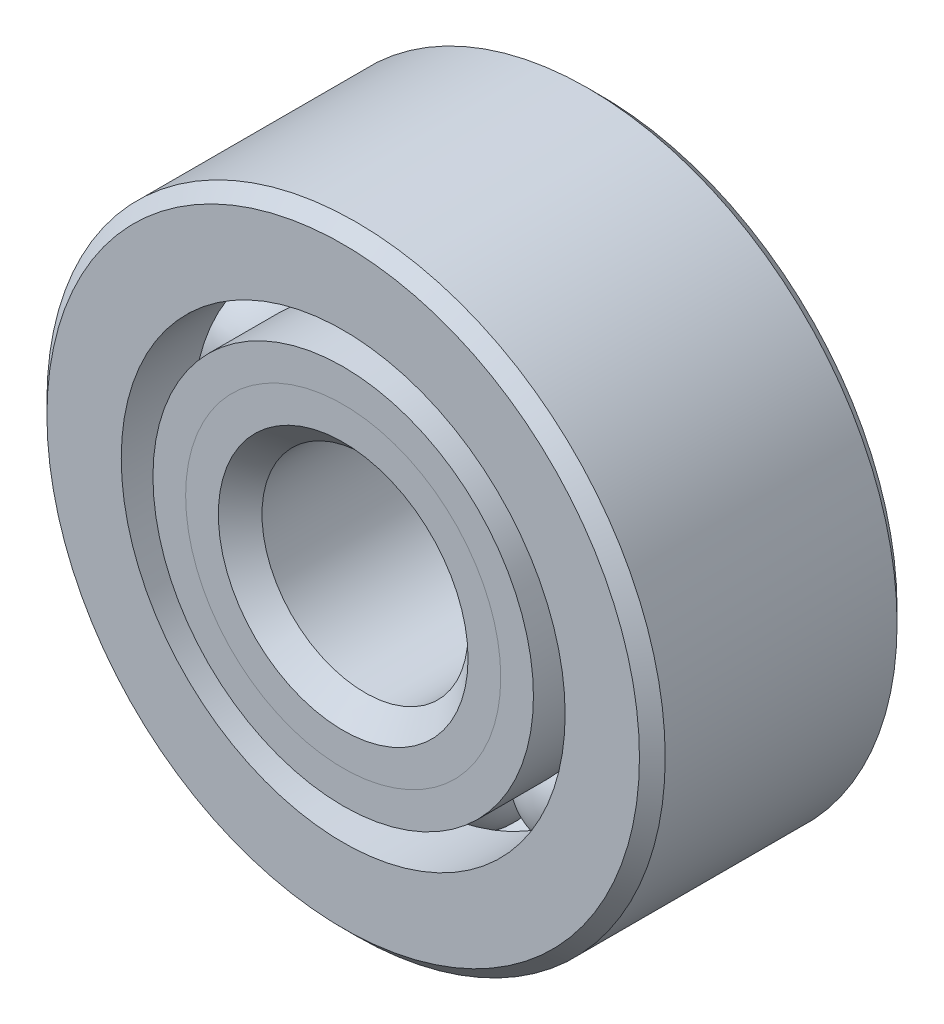
ISO-10303-21;
HEADER;
FILE_DESCRIPTION(('STEP AP214'),'2;1');
FILE_NAME('part.step','',(''),(''),'','','');
FILE_SCHEMA(('AUTOMOTIVE_DESIGN { 1 0 10303 214 1 1 1 1 }'));
ENDSEC;
DATA;
#1=APPLICATION_CONTEXT('core data for automotive mechanical design processes');
#2=APPLICATION_PROTOCOL_DEFINITION('international standard','automotive_design',2000,#1);
#3=PRODUCT_CONTEXT('',#1,'mechanical');
#4=PRODUCT('Part','Part','',(#3));
#5=PRODUCT_RELATED_PRODUCT_CATEGORY('part','',(#4));
#6=PRODUCT_DEFINITION_FORMATION('','',#4);
#7=PRODUCT_DEFINITION_CONTEXT('part definition',#1,'design');
#8=PRODUCT_DEFINITION('design','',#6,#7);
#9=PRODUCT_DEFINITION_SHAPE('','',#8);
#10=(LENGTH_UNIT() NAMED_UNIT(*) SI_UNIT(.MILLI.,.METRE.));
#11=(NAMED_UNIT(*) PLANE_ANGLE_UNIT() SI_UNIT($,.RADIAN.));
#12=(NAMED_UNIT(*) SI_UNIT($,.STERADIAN.) SOLID_ANGLE_UNIT());
#13=UNCERTAINTY_MEASURE_WITH_UNIT(LENGTH_MEASURE(1.E-05),#10,'distance_accuracy_value','');
#14=(GEOMETRIC_REPRESENTATION_CONTEXT(3) GLOBAL_UNCERTAINTY_ASSIGNED_CONTEXT((#13)) GLOBAL_UNIT_ASSIGNED_CONTEXT((#10,
#11,#12)) REPRESENTATION_CONTEXT('',''));
#15=CARTESIAN_POINT('',(0.,0.,0.));
#16=DIRECTION('',(0.,0.,1.));
#17=DIRECTION('',(1.,0.,0.));
#18=AXIS2_PLACEMENT_3D('',#15,#16,#17);
#19=CARTESIAN_POINT('',(-1.86621817602857,2.56862895714048,0.));
#20=DIRECTION('',(0.,0.,1.));
#21=DIRECTION('',(-0.587785252292462,0.809016994374955,0.));
#22=AXIS2_PLACEMENT_3D('',#19,#20,#21);
#23=SPHERICAL_SURFACE('',#22,0.915136422466876);
#24=CARTESIAN_POINT('',(-1.86621817602857,2.56862895714048,0.915136422466875));
#25=VERTEX_POINT('',#24);
#26=VERTEX_LOOP('',#25);
#27=FACE_BOUND('',#26,.T.);
#28=ADVANCED_FACE('F39',(#27),#23,.T.);
#29=CLOSED_SHELL('',(#28));
#30=MANIFOLD_SOLID_BREP('B2',#29);
#31=CARTESIAN_POINT('',(-3.0196044392371,0.981128957140492,0.));
#32=DIRECTION('',(0.,0.,1.));
#33=DIRECTION('',(-0.95105651629515,0.309016994374958,0.));
#34=AXIS2_PLACEMENT_3D('',#31,#32,#33);
#35=SPHERICAL_SURFACE('',#34,0.915136422466876);
#36=CARTESIAN_POINT('',(-3.0196044392371,0.981128957140492,0.915136422466875));
#37=VERTEX_POINT('',#36);
#38=VERTEX_LOOP('',#37);
#39=FACE_BOUND('',#38,.T.);
#40=ADVANCED_FACE('F72',(#39),#35,.T.);
#41=CLOSED_SHELL('',(#40));
#42=MANIFOLD_SOLID_BREP('B6',#41);
#43=CARTESIAN_POINT('',(-3.01960443923712,-0.981128957140429,0.));
#44=DIRECTION('',(0.,0.,1.));
#45=DIRECTION('',(-0.951056516295157,-0.309016994374938,0.));
#46=AXIS2_PLACEMENT_3D('',#43,#44,#45);
#47=SPHERICAL_SURFACE('',#46,0.915136422466876);
#48=CARTESIAN_POINT('',(-3.01960443923712,-0.981128957140429,0.915136422466875));
#49=VERTEX_POINT('',#48);
#50=VERTEX_LOOP('',#49);
#51=FACE_BOUND('',#50,.T.);
#52=ADVANCED_FACE('F105',(#51),#47,.T.);
#53=CLOSED_SHELL('',(#52));
#54=MANIFOLD_SOLID_BREP('B35',#53);
#55=CARTESIAN_POINT('',(-1.86621817602862,-2.56862895714044,0.));
#56=DIRECTION('',(0.,0.,1.));
#57=DIRECTION('',(-0.58778525229248,-0.809016994374942,0.));
#58=AXIS2_PLACEMENT_3D('',#55,#56,#57);
#59=SPHERICAL_SURFACE('',#58,0.915136422466876);
#60=CARTESIAN_POINT('',(-1.86621817602862,-2.56862895714044,0.915136422466875));
#61=VERTEX_POINT('',#60);
#62=VERTEX_LOOP('',#61);
#63=FACE_BOUND('',#62,.T.);
#64=ADVANCED_FACE('F138',(#63),#59,.T.);
#65=CLOSED_SHELL('',(#64));
#66=MANIFOLD_SOLID_BREP('B68',#65);
#67=CARTESIAN_POINT('',(0.,-3.175,0.));
#68=DIRECTION('',(0.,0.,1.));
#69=DIRECTION('',(0.,-1.,0.));
#70=AXIS2_PLACEMENT_3D('',#67,#68,#69);
#71=SPHERICAL_SURFACE('',#70,0.915136422466876);
#72=CARTESIAN_POINT('',(0.,-3.175,0.915136422466875));
#73=VERTEX_POINT('',#72);
#74=VERTEX_LOOP('',#73);
#75=FACE_BOUND('',#74,.T.);
#76=ADVANCED_FACE('F171',(#75),#71,.T.);
#77=CLOSED_SHELL('',(#76));
#78=MANIFOLD_SOLID_BREP('B101',#77);
#79=CARTESIAN_POINT('',(1.86621817602859,-2.56862895714047,0.));
#80=DIRECTION('',(0.,0.,1.));
#81=DIRECTION('',(0.587785252292469,-0.809016994374951,0.));
#82=AXIS2_PLACEMENT_3D('',#79,#80,#81);
#83=SPHERICAL_SURFACE('',#82,0.915136422466876);
#84=CARTESIAN_POINT('',(1.86621817602859,-2.56862895714047,0.915136422466875));
#85=VERTEX_POINT('',#84);
#86=VERTEX_LOOP('',#85);
#87=FACE_BOUND('',#86,.T.);
#88=ADVANCED_FACE('F204',(#87),#83,.T.);
#89=CLOSED_SHELL('',(#88));
#90=MANIFOLD_SOLID_BREP('B134',#89);
#91=CARTESIAN_POINT('',(3.01960443923711,-0.981128957140471,0.));
#92=DIRECTION('',(0.,0.,1.));
#93=DIRECTION('',(0.951056516295152,-0.309016994374952,0.));
#94=AXIS2_PLACEMENT_3D('',#91,#92,#93);
#95=SPHERICAL_SURFACE('',#94,0.915136422466876);
#96=CARTESIAN_POINT('',(3.01960443923711,-0.981128957140471,0.915136422466875));
#97=VERTEX_POINT('',#96);
#98=VERTEX_LOOP('',#97);
#99=FACE_BOUND('',#98,.T.);
#100=ADVANCED_FACE('F237',(#99),#95,.T.);
#101=CLOSED_SHELL('',(#100));
#102=MANIFOLD_SOLID_BREP('B167',#101);
#103=CARTESIAN_POINT('',(3.01960443923712,0.98112895714045,0.));
#104=DIRECTION('',(0.,0.,1.));
#105=DIRECTION('',(0.951056516295155,0.309016994374945,0.));
#106=AXIS2_PLACEMENT_3D('',#103,#104,#105);
#107=SPHERICAL_SURFACE('',#106,0.915136422466876);
#108=CARTESIAN_POINT('',(3.01960443923712,0.98112895714045,0.915136422466875));
#109=VERTEX_POINT('',#108);
#110=VERTEX_LOOP('',#109);
#111=FACE_BOUND('',#110,.T.);
#112=ADVANCED_FACE('F270',(#111),#107,.T.);
#113=CLOSED_SHELL('',(#112));
#114=MANIFOLD_SOLID_BREP('B200',#113);
#115=CARTESIAN_POINT('',(1.86621817602861,2.56862895714046,0.));
#116=DIRECTION('',(0.,0.,1.));
#117=DIRECTION('',(0.587785252292474,0.809016994374947,0.));
#118=AXIS2_PLACEMENT_3D('',#115,#116,#117);
#119=SPHERICAL_SURFACE('',#118,0.915136422466876);
#120=CARTESIAN_POINT('',(1.86621817602861,2.56862895714046,0.915136422466875));
#121=VERTEX_POINT('',#120);
#122=VERTEX_LOOP('',#121);
#123=FACE_BOUND('',#122,.T.);
#124=ADVANCED_FACE('F303',(#123),#119,.T.);
#125=CLOSED_SHELL('',(#124));
#126=MANIFOLD_SOLID_BREP('B233',#125);
#127=CARTESIAN_POINT('',(0.,3.175,0.));
#128=DIRECTION('',(0.,0.,1.));
#129=DIRECTION('',(0.,1.,0.));
#130=AXIS2_PLACEMENT_3D('',#127,#128,#129);
#131=SPHERICAL_SURFACE('',#130,0.915136422466876);
#132=CARTESIAN_POINT('',(0.,3.175,0.915136422466875));
#133=VERTEX_POINT('',#132);
#134=VERTEX_LOOP('',#133);
#135=FACE_BOUND('',#134,.T.);
#136=ADVANCED_FACE('F338',(#135),#131,.T.);
#137=CLOSED_SHELL('',(#136));
#138=MANIFOLD_SOLID_BREP('B266',#137);
#139=CARTESIAN_POINT('',(0.,2.4272255097679,1.984375));
#140=DIRECTION('',(0.,0.,-1.));
#141=DIRECTION('',(-1.,0.,0.));
#142=AXIS2_PLACEMENT_3D('',#139,#140,#141);
#143=PLANE('',#142);
#144=CARTESIAN_POINT('',(0.,0.,1.984375));
#145=DIRECTION('',(0.,0.,1.));
#146=DIRECTION('',(1.,0.,0.));
#147=AXIS2_PLACEMENT_3D('',#144,#145,#146);
#148=CIRCLE('',#147,1.92368178876656);
#149=CARTESIAN_POINT('',(1.92368178876656,0.,1.984375));
#150=VERTEX_POINT('',#149);
#151=EDGE_CURVE('E392',#150,#150,#148,.T.);
#152=ORIENTED_EDGE('',*,*,#151,.F.);
#153=EDGE_LOOP('',(#152));
#154=FACE_BOUND('',#153,.T.);
#155=CARTESIAN_POINT('',(0.,0.,1.984375));
#156=DIRECTION('',(0.,0.,1.));
#157=DIRECTION('',(1.,0.,0.));
#158=AXIS2_PLACEMENT_3D('',#155,#156,#157);
#159=CIRCLE('',#158,2.4272255097679);
#160=CARTESIAN_POINT('',(2.4272255097679,0.,1.984375));
#161=VERTEX_POINT('',#160);
#162=EDGE_CURVE('E337',#161,#161,#159,.T.);
#163=ORIENTED_EDGE('',*,*,#162,.T.);
#164=EDGE_LOOP('',(#163));
#165=FACE_BOUND('',#164,.T.);
#166=ADVANCED_FACE('F358',(#154,#165),#143,.F.);
#167=CARTESIAN_POINT('',(0.,0.,1.48083127899867));
#168=DIRECTION('',(0.,0.,1.));
#169=DIRECTION('',(1.,0.,0.));
#170=AXIS2_PLACEMENT_3D('',#167,#168,#169);
#171=CONICAL_SURFACE('',#170,1.92368178876656,0.78539816339745);
#172=ORIENTED_EDGE('',*,*,#162,.F.);
#173=EDGE_LOOP('',(#172));
#174=FACE_BOUND('',#173,.T.);
#175=CARTESIAN_POINT('',(0.,0.,1.48083127899867));
#176=DIRECTION('',(0.,0.,1.));
#177=DIRECTION('',(1.,0.,0.));
#178=AXIS2_PLACEMENT_3D('',#175,#176,#177);
#179=CIRCLE('',#178,1.92368178876656);
#180=CARTESIAN_POINT('',(1.92368178876656,0.,1.48083127899867));
#181=VERTEX_POINT('',#180);
#182=EDGE_CURVE('E364',#181,#181,#179,.T.);
#183=ORIENTED_EDGE('',*,*,#182,.T.);
#184=EDGE_LOOP('',(#183));
#185=FACE_BOUND('',#184,.T.);
#186=ADVANCED_FACE('F399',(#174,#185),#171,.T.);
#187=CARTESIAN_POINT('',(0.,0.,1.984375));
#188=DIRECTION('',(0.,0.,1.));
#189=DIRECTION('',(1.,0.,0.));
#190=AXIS2_PLACEMENT_3D('',#187,#188,#189);
#191=CYLINDRICAL_SURFACE('',#190,1.92368178876656);
#192=ORIENTED_EDGE('',*,*,#182,.F.);
#193=EDGE_LOOP('',(#192));
#194=FACE_BOUND('',#193,.T.);
#195=CARTESIAN_POINT('',(0.,0.,0.));
#196=DIRECTION('',(0.,0.,1.));
#197=DIRECTION('',(1.,0.,0.));
#198=AXIS2_PLACEMENT_3D('',#195,#196,#197);
#199=CIRCLE('',#198,1.92368178876656);
#200=CARTESIAN_POINT('',(1.92368178876656,0.,0.));
#201=VERTEX_POINT('',#200);
#202=EDGE_CURVE('E368',#201,#201,#199,.T.);
#203=ORIENTED_EDGE('',*,*,#202,.T.);
#204=EDGE_LOOP('',(#203));
#205=FACE_BOUND('',#204,.T.);
#206=ADVANCED_FACE('F403',(#194,#205),#191,.T.);
#207=CARTESIAN_POINT('',(0.,1.92368178876656,0.));
#208=DIRECTION('',(0.,0.,-1.));
#209=DIRECTION('',(-1.,0.,0.));
#210=AXIS2_PLACEMENT_3D('',#207,#208,#209);
#211=PLANE('',#210);
#212=ORIENTED_EDGE('',*,*,#202,.F.);
#213=EDGE_LOOP('',(#212));
#214=FACE_BOUND('',#213,.T.);
#215=CARTESIAN_POINT('',(0.,0.,0.));
#216=DIRECTION('',(0.,0.,1.));
#217=DIRECTION('',(1.,0.,0.));
#218=AXIS2_PLACEMENT_3D('',#215,#216,#217);
#219=CIRCLE('',#218,2.25986357753312);
#220=CARTESIAN_POINT('',(2.25986357753312,0.,0.));
#221=VERTEX_POINT('',#220);
#222=EDGE_CURVE('E372',#221,#221,#219,.T.);
#223=ORIENTED_EDGE('',*,*,#222,.T.);
#224=EDGE_LOOP('',(#223));
#225=FACE_BOUND('',#224,.T.);
#226=ADVANCED_FACE('F408',(#214,#225),#211,.F.);
#227=CARTESIAN_POINT('',(0.,0.,0.));
#228=DIRECTION('',(0.,0.,1.));
#229=DIRECTION('',(1.,0.,0.));
#230=AXIS2_PLACEMENT_3D('',#227,#228,#229);
#231=TOROIDAL_SURFACE('',#230,3.175,0.915136422466876);
#232=ORIENTED_EDGE('',*,*,#222,.F.);
#233=EDGE_LOOP('',(#232));
#234=FACE_BOUND('',#233,.T.);
#235=CARTESIAN_POINT('',(0.,0.,-0.881944444444445));
#236=DIRECTION('',(0.,0.,1.));
#237=DIRECTION('',(1.,0.,0.));
#238=AXIS2_PLACEMENT_3D('',#235,#236,#237);
#239=CIRCLE('',#238,2.93076923076923);
#240=CARTESIAN_POINT('',(2.93076923076923,0.,-0.881944444444445));
#241=VERTEX_POINT('',#240);
#242=EDGE_CURVE('E377',#241,#241,#239,.T.);
#243=ORIENTED_EDGE('',*,*,#242,.T.);
#244=EDGE_LOOP('',(#243));
#245=FACE_BOUND('',#244,.T.);
#246=ADVANCED_FACE('F414',(#234,#245),#231,.F.);
#247=CARTESIAN_POINT('',(0.,0.,1.984375));
#248=DIRECTION('',(0.,0.,1.));
#249=DIRECTION('',(1.,0.,0.));
#250=AXIS2_PLACEMENT_3D('',#247,#248,#249);
#251=CYLINDRICAL_SURFACE('',#250,2.93076923076923);
#252=ORIENTED_EDGE('',*,*,#242,.F.);
#253=EDGE_LOOP('',(#252));
#254=FACE_BOUND('',#253,.T.);
#255=CARTESIAN_POINT('',(0.,0.,-1.984375));
#256=DIRECTION('',(0.,0.,1.));
#257=DIRECTION('',(1.,0.,0.));
#258=AXIS2_PLACEMENT_3D('',#255,#256,#257);
#259=CIRCLE('',#258,2.93076923076923);
#260=CARTESIAN_POINT('',(2.93076923076923,0.,-1.984375));
#261=VERTEX_POINT('',#260);
#262=EDGE_CURVE('E380',#261,#261,#259,.T.);
#263=ORIENTED_EDGE('',*,*,#262,.T.);
#264=EDGE_LOOP('',(#263));
#265=FACE_BOUND('',#264,.T.);
#266=ADVANCED_FACE('F418',(#254,#265),#251,.T.);
#267=CARTESIAN_POINT('',(0.,1.7859375,-1.984375));
#268=DIRECTION('',(0.,0.,1.));
#269=DIRECTION('',(1.,0.,0.));
#270=AXIS2_PLACEMENT_3D('',#267,#268,#269);
#271=PLANE('',#270);
#272=ORIENTED_EDGE('',*,*,#262,.F.);
#273=EDGE_LOOP('',(#272));
#274=FACE_BOUND('',#273,.T.);
#275=CARTESIAN_POINT('',(0.,0.,-1.984375));
#276=DIRECTION('',(0.,0.,1.));
#277=DIRECTION('',(1.,0.,0.));
#278=AXIS2_PLACEMENT_3D('',#275,#276,#277);
#279=CIRCLE('',#278,1.7859375);
#280=CARTESIAN_POINT('',(1.7859375,0.,-1.984375));
#281=VERTEX_POINT('',#280);
#282=EDGE_CURVE('E383',#281,#281,#279,.T.);
#283=ORIENTED_EDGE('',*,*,#282,.T.);
#284=EDGE_LOOP('',(#283));
#285=FACE_BOUND('',#284,.T.);
#286=ADVANCED_FACE('F422',(#274,#285),#271,.F.);
#287=CARTESIAN_POINT('',(0.,0.,-1.7859375));
#288=DIRECTION('',(0.,0.,-1.));
#289=DIRECTION('',(-1.,0.,0.));
#290=AXIS2_PLACEMENT_3D('',#287,#288,#289);
#291=CONICAL_SURFACE('',#290,1.5875,0.785398163397446);
#292=ORIENTED_EDGE('',*,*,#282,.F.);
#293=EDGE_LOOP('',(#292));
#294=FACE_BOUND('',#293,.T.);
#295=CARTESIAN_POINT('',(0.,0.,-1.7859375));
#296=DIRECTION('',(0.,0.,1.));
#297=DIRECTION('',(1.,0.,0.));
#298=AXIS2_PLACEMENT_3D('',#295,#296,#297);
#299=CIRCLE('',#298,1.5875);
#300=CARTESIAN_POINT('',(1.5875,0.,-1.7859375));
#301=VERTEX_POINT('',#300);
#302=EDGE_CURVE('E386',#301,#301,#299,.T.);
#303=ORIENTED_EDGE('',*,*,#302,.T.);
#304=EDGE_LOOP('',(#303));
#305=FACE_BOUND('',#304,.T.);
#306=ADVANCED_FACE('F426',(#294,#305),#291,.F.);
#307=CARTESIAN_POINT('',(0.,0.,1.984375));
#308=DIRECTION('',(0.,0.,1.));
#309=DIRECTION('',(1.,0.,0.));
#310=AXIS2_PLACEMENT_3D('',#307,#308,#309);
#311=CYLINDRICAL_SURFACE('',#310,1.5875);
#312=ORIENTED_EDGE('',*,*,#302,.F.);
#313=EDGE_LOOP('',(#312));
#314=FACE_BOUND('',#313,.T.);
#315=CARTESIAN_POINT('',(0.,0.,1.64819321123344));
#316=DIRECTION('',(0.,0.,1.));
#317=DIRECTION('',(1.,0.,0.));
#318=AXIS2_PLACEMENT_3D('',#315,#316,#317);
#319=CIRCLE('',#318,1.5875);
#320=CARTESIAN_POINT('',(1.5875,0.,1.64819321123344));
#321=VERTEX_POINT('',#320);
#322=EDGE_CURVE('E389',#321,#321,#319,.T.);
#323=ORIENTED_EDGE('',*,*,#322,.T.);
#324=EDGE_LOOP('',(#323));
#325=FACE_BOUND('',#324,.T.);
#326=ADVANCED_FACE('F430',(#314,#325),#311,.F.);
#327=CARTESIAN_POINT('',(0.,0.,1.984375));
#328=DIRECTION('',(0.,0.,1.));
#329=DIRECTION('',(1.,0.,0.));
#330=AXIS2_PLACEMENT_3D('',#327,#328,#329);
#331=CONICAL_SURFACE('',#330,1.92368178876656,0.78539816339745);
#332=ORIENTED_EDGE('',*,*,#322,.F.);
#333=EDGE_LOOP('',(#332));
#334=FACE_BOUND('',#333,.T.);
#335=ORIENTED_EDGE('',*,*,#151,.T.);
#336=EDGE_LOOP('',(#335));
#337=FACE_BOUND('',#336,.T.);
#338=ADVANCED_FACE('F396',(#334,#337),#331,.F.);
#339=CLOSED_SHELL('',(#166,#186,#206,#226,#246,#266,#286,#306,#326,#338));
#340=MANIFOLD_SOLID_BREP('B299',#339);
#341=CARTESIAN_POINT('',(0.,2.93076923076923,1.984375));
#342=DIRECTION('',(0.,0.,-1.));
#343=DIRECTION('',(-1.,0.,0.));
#344=AXIS2_PLACEMENT_3D('',#341,#342,#343);
#345=PLANE('',#344);
#346=CARTESIAN_POINT('',(0.,0.,1.984375));
#347=DIRECTION('',(0.,0.,1.));
#348=DIRECTION('',(1.,0.,0.));
#349=AXIS2_PLACEMENT_3D('',#346,#347,#348);
#350=CIRCLE('',#349,2.4272255097679);
#351=CARTESIAN_POINT('',(2.4272255097679,0.,1.984375));
#352=VERTEX_POINT('',#351);
#353=EDGE_CURVE('E357',#352,#352,#350,.T.);
#354=ORIENTED_EDGE('',*,*,#353,.F.);
#355=EDGE_LOOP('',(#354));
#356=FACE_BOUND('',#355,.T.);
#357=CARTESIAN_POINT('',(0.,0.,1.984375));
#358=DIRECTION('',(0.,0.,1.));
#359=DIRECTION('',(1.,0.,0.));
#360=AXIS2_PLACEMENT_3D('',#357,#358,#359);
#361=CIRCLE('',#360,2.93076923076923);
#362=CARTESIAN_POINT('',(2.93076923076923,0.,1.984375));
#363=VERTEX_POINT('',#362);
#364=EDGE_CURVE('E538',#363,#363,#361,.T.);
#365=ORIENTED_EDGE('',*,*,#364,.T.);
#366=EDGE_LOOP('',(#365));
#367=FACE_BOUND('',#366,.T.);
#368=ADVANCED_FACE('F516',(#356,#367),#345,.F.);
#369=CARTESIAN_POINT('',(0.,0.,1.984375));
#370=DIRECTION('',(0.,0.,1.));
#371=DIRECTION('',(1.,0.,0.));
#372=AXIS2_PLACEMENT_3D('',#369,#370,#371);
#373=CONICAL_SURFACE('',#372,2.4272255097679,0.78539816339745);
#374=CARTESIAN_POINT('',(0.,0.,1.48083127899867));
#375=DIRECTION('',(0.,0.,1.));
#376=DIRECTION('',(1.,0.,0.));
#377=AXIS2_PLACEMENT_3D('',#374,#375,#376);
#378=CIRCLE('',#377,1.92368178876656);
#379=CARTESIAN_POINT('',(1.92368178876656,0.,1.48083127899867));
#380=VERTEX_POINT('',#379);
#381=EDGE_CURVE('E522',#380,#380,#378,.T.);
#382=ORIENTED_EDGE('',*,*,#381,.F.);
#383=EDGE_LOOP('',(#382));
#384=FACE_BOUND('',#383,.T.);
#385=ORIENTED_EDGE('',*,*,#353,.T.);
#386=EDGE_LOOP('',(#385));
#387=FACE_BOUND('',#386,.T.);
#388=ADVANCED_FACE('F563',(#384,#387),#373,.F.);
#389=CARTESIAN_POINT('',(0.,0.,1.984375));
#390=DIRECTION('',(0.,0.,1.));
#391=DIRECTION('',(1.,0.,0.));
#392=AXIS2_PLACEMENT_3D('',#389,#390,#391);
#393=CYLINDRICAL_SURFACE('',#392,1.92368178876656);
#394=CARTESIAN_POINT('',(0.,0.,0.));
#395=DIRECTION('',(0.,0.,1.));
#396=DIRECTION('',(1.,0.,0.));
#397=AXIS2_PLACEMENT_3D('',#394,#395,#396);
#398=CIRCLE('',#397,1.92368178876656);
#399=CARTESIAN_POINT('',(1.92368178876656,0.,0.));
#400=VERTEX_POINT('',#399);
#401=EDGE_CURVE('E526',#400,#400,#398,.T.);
#402=ORIENTED_EDGE('',*,*,#401,.F.);
#403=EDGE_LOOP('',(#402));
#404=FACE_BOUND('',#403,.T.);
#405=ORIENTED_EDGE('',*,*,#381,.T.);
#406=EDGE_LOOP('',(#405));
#407=FACE_BOUND('',#406,.T.);
#408=ADVANCED_FACE('F558',(#404,#407),#393,.F.);
#409=CARTESIAN_POINT('',(0.,1.92368178876656,0.));
#410=DIRECTION('',(0.,0.,1.));
#411=DIRECTION('',(1.,0.,0.));
#412=AXIS2_PLACEMENT_3D('',#409,#410,#411);
#413=PLANE('',#412);
#414=CARTESIAN_POINT('',(0.,0.,0.));
#415=DIRECTION('',(0.,0.,1.));
#416=DIRECTION('',(1.,0.,0.));
#417=AXIS2_PLACEMENT_3D('',#414,#415,#416);
#418=CIRCLE('',#417,2.25986357753312);
#419=CARTESIAN_POINT('',(2.25986357753312,0.,0.));
#420=VERTEX_POINT('',#419);
#421=EDGE_CURVE('E530',#420,#420,#418,.T.);
#422=ORIENTED_EDGE('',*,*,#421,.F.);
#423=EDGE_LOOP('',(#422));
#424=FACE_BOUND('',#423,.T.);
#425=ORIENTED_EDGE('',*,*,#401,.T.);
#426=EDGE_LOOP('',(#425));
#427=FACE_BOUND('',#426,.T.);
#428=ADVANCED_FACE('F552',(#424,#427),#413,.F.);
#429=CARTESIAN_POINT('',(0.,0.,0.));
#430=DIRECTION('',(0.,0.,1.));
#431=DIRECTION('',(1.,0.,0.));
#432=AXIS2_PLACEMENT_3D('',#429,#430,#431);
#433=TOROIDAL_SURFACE('',#432,3.175,0.915136422466876);
#434=CARTESIAN_POINT('',(0.,0.,0.881944444444444));
#435=DIRECTION('',(0.,0.,1.));
#436=DIRECTION('',(1.,0.,0.));
#437=AXIS2_PLACEMENT_3D('',#434,#435,#436);
#438=CIRCLE('',#437,2.93076923076923);
#439=CARTESIAN_POINT('',(2.93076923076923,0.,0.881944444444444));
#440=VERTEX_POINT('',#439);
#441=EDGE_CURVE('E535',#440,#440,#438,.T.);
#442=ORIENTED_EDGE('',*,*,#441,.F.);
#443=EDGE_LOOP('',(#442));
#444=FACE_BOUND('',#443,.T.);
#445=ORIENTED_EDGE('',*,*,#421,.T.);
#446=EDGE_LOOP('',(#445));
#447=FACE_BOUND('',#446,.T.);
#448=ADVANCED_FACE('F546',(#444,#447),#433,.F.);
#449=CARTESIAN_POINT('',(0.,0.,1.984375));
#450=DIRECTION('',(0.,0.,1.));
#451=DIRECTION('',(1.,0.,0.));
#452=AXIS2_PLACEMENT_3D('',#449,#450,#451);
#453=CYLINDRICAL_SURFACE('',#452,2.93076923076923);
#454=ORIENTED_EDGE('',*,*,#364,.F.);
#455=EDGE_LOOP('',(#454));
#456=FACE_BOUND('',#455,.T.);
#457=ORIENTED_EDGE('',*,*,#441,.T.);
#458=EDGE_LOOP('',(#457));
#459=FACE_BOUND('',#458,.T.);
#460=ADVANCED_FACE('F543',(#456,#459),#453,.T.);
#461=CLOSED_SHELL('',(#368,#388,#408,#428,#448,#460));
#462=MANIFOLD_SOLID_BREP('B332',#461);
#463=CARTESIAN_POINT('',(0.,0.,1.7859375));
#464=DIRECTION('',(0.,0.,-1.));
#465=DIRECTION('',(-1.,0.,0.));
#466=AXIS2_PLACEMENT_3D('',#463,#464,#465);
#467=CONICAL_SURFACE('',#466,4.7625,0.785398163397447);
#468=CARTESIAN_POINT('',(0.,0.,1.984375));
#469=DIRECTION('',(0.,0.,1.));
#470=DIRECTION('',(1.,0.,0.));
#471=AXIS2_PLACEMENT_3D('',#468,#469,#470);
#472=CIRCLE('',#471,4.5640625);
#473=CARTESIAN_POINT('',(4.5640625,0.,1.984375));
#474=VERTEX_POINT('',#473);
#475=EDGE_CURVE('E635',#474,#474,#472,.T.);
#476=ORIENTED_EDGE('',*,*,#475,.F.);
#477=EDGE_LOOP('',(#476));
#478=FACE_BOUND('',#477,.T.);
#479=CARTESIAN_POINT('',(0.,0.,1.7859375));
#480=DIRECTION('',(0.,0.,1.));
#481=DIRECTION('',(1.,0.,0.));
#482=AXIS2_PLACEMENT_3D('',#479,#480,#481);
#483=CIRCLE('',#482,4.7625);
#484=CARTESIAN_POINT('',(4.7625,0.,1.7859375));
#485=VERTEX_POINT('',#484);
#486=EDGE_CURVE('E515',#485,#485,#483,.T.);
#487=ORIENTED_EDGE('',*,*,#486,.T.);
#488=EDGE_LOOP('',(#487));
#489=FACE_BOUND('',#488,.T.);
#490=ADVANCED_FACE('F607',(#478,#489),#467,.T.);
#491=CARTESIAN_POINT('',(0.,0.,1.984375));
#492=DIRECTION('',(0.,0.,1.));
#493=DIRECTION('',(1.,0.,0.));
#494=AXIS2_PLACEMENT_3D('',#491,#492,#493);
#495=CYLINDRICAL_SURFACE('',#494,4.7625);
#496=ORIENTED_EDGE('',*,*,#486,.F.);
#497=EDGE_LOOP('',(#496));
#498=FACE_BOUND('',#497,.T.);
#499=CARTESIAN_POINT('',(0.,0.,-1.7859375));
#500=DIRECTION('',(0.,0.,1.));
#501=DIRECTION('',(1.,0.,0.));
#502=AXIS2_PLACEMENT_3D('',#499,#500,#501);
#503=CIRCLE('',#502,4.7625);
#504=CARTESIAN_POINT('',(4.7625,0.,-1.7859375));
#505=VERTEX_POINT('',#504);
#506=EDGE_CURVE('E613',#505,#505,#503,.T.);
#507=ORIENTED_EDGE('',*,*,#506,.T.);
#508=EDGE_LOOP('',(#507));
#509=FACE_BOUND('',#508,.T.);
#510=ADVANCED_FACE('F642',(#498,#509),#495,.T.);
#511=CARTESIAN_POINT('',(0.,0.,-1.984375));
#512=DIRECTION('',(0.,0.,1.));
#513=DIRECTION('',(1.,0.,0.));
#514=AXIS2_PLACEMENT_3D('',#511,#512,#513);
#515=CONICAL_SURFACE('',#514,4.5640625,0.785398163397446);
#516=ORIENTED_EDGE('',*,*,#506,.F.);
#517=EDGE_LOOP('',(#516));
#518=FACE_BOUND('',#517,.T.);
#519=CARTESIAN_POINT('',(0.,0.,-1.984375));
#520=DIRECTION('',(0.,0.,1.));
#521=DIRECTION('',(1.,0.,0.));
#522=AXIS2_PLACEMENT_3D('',#519,#520,#521);
#523=CIRCLE('',#522,4.5640625);
#524=CARTESIAN_POINT('',(4.5640625,0.,-1.984375));
#525=VERTEX_POINT('',#524);
#526=EDGE_CURVE('E617',#525,#525,#523,.T.);
#527=ORIENTED_EDGE('',*,*,#526,.T.);
#528=EDGE_LOOP('',(#527));
#529=FACE_BOUND('',#528,.T.);
#530=ADVANCED_FACE('F646',(#518,#529),#515,.T.);
#531=CARTESIAN_POINT('',(0.,4.5640625,-1.984375));
#532=DIRECTION('',(0.,0.,1.));
#533=DIRECTION('',(1.,0.,0.));
#534=AXIS2_PLACEMENT_3D('',#531,#532,#533);
#535=PLANE('',#534);
#536=ORIENTED_EDGE('',*,*,#526,.F.);
#537=EDGE_LOOP('',(#536));
#538=FACE_BOUND('',#537,.T.);
#539=CARTESIAN_POINT('',(0.,0.,-1.984375));
#540=DIRECTION('',(0.,0.,1.));
#541=DIRECTION('',(1.,0.,0.));
#542=AXIS2_PLACEMENT_3D('',#539,#540,#541);
#543=CIRCLE('',#542,3.41923076923077);
#544=CARTESIAN_POINT('',(3.41923076923077,0.,-1.984375));
#545=VERTEX_POINT('',#544);
#546=EDGE_CURVE('E621',#545,#545,#543,.T.);
#547=ORIENTED_EDGE('',*,*,#546,.T.);
#548=EDGE_LOOP('',(#547));
#549=FACE_BOUND('',#548,.T.);
#550=ADVANCED_FACE('F651',(#538,#549),#535,.F.);
#551=CARTESIAN_POINT('',(0.,0.,1.984375));
#552=DIRECTION('',(0.,0.,1.));
#553=DIRECTION('',(1.,0.,0.));
#554=AXIS2_PLACEMENT_3D('',#551,#552,#553);
#555=CYLINDRICAL_SURFACE('',#554,3.41923076923077);
#556=ORIENTED_EDGE('',*,*,#546,.F.);
#557=EDGE_LOOP('',(#556));
#558=FACE_BOUND('',#557,.T.);
#559=CARTESIAN_POINT('',(0.,0.,-0.881944444444445));
#560=DIRECTION('',(0.,0.,1.));
#561=DIRECTION('',(1.,0.,0.));
#562=AXIS2_PLACEMENT_3D('',#559,#560,#561);
#563=CIRCLE('',#562,3.41923076923077);
#564=CARTESIAN_POINT('',(3.41923076923077,0.,-0.881944444444445));
#565=VERTEX_POINT('',#564);
#566=EDGE_CURVE('E626',#565,#565,#563,.T.);
#567=ORIENTED_EDGE('',*,*,#566,.T.);
#568=EDGE_LOOP('',(#567));
#569=FACE_BOUND('',#568,.T.);
#570=ADVANCED_FACE('F657',(#558,#569),#555,.F.);
#571=CARTESIAN_POINT('',(0.,0.,0.));
#572=DIRECTION('',(0.,0.,1.));
#573=DIRECTION('',(1.,0.,0.));
#574=AXIS2_PLACEMENT_3D('',#571,#572,#573);
#575=TOROIDAL_SURFACE('',#574,3.175,0.915136422466876);
#576=ORIENTED_EDGE('',*,*,#566,.F.);
#577=EDGE_LOOP('',(#576));
#578=FACE_BOUND('',#577,.T.);
#579=CARTESIAN_POINT('',(0.,0.,0.881944444444444));
#580=DIRECTION('',(0.,0.,1.));
#581=DIRECTION('',(1.,0.,0.));
#582=AXIS2_PLACEMENT_3D('',#579,#580,#581);
#583=CIRCLE('',#582,3.41923076923077);
#584=CARTESIAN_POINT('',(3.41923076923077,0.,0.881944444444444));
#585=VERTEX_POINT('',#584);
#586=EDGE_CURVE('E629',#585,#585,#583,.T.);
#587=ORIENTED_EDGE('',*,*,#586,.T.);
#588=EDGE_LOOP('',(#587));
#589=FACE_BOUND('',#588,.T.);
#590=ADVANCED_FACE('F661',(#578,#589),#575,.F.);
#591=CARTESIAN_POINT('',(0.,0.,1.984375));
#592=DIRECTION('',(0.,0.,1.));
#593=DIRECTION('',(1.,0.,0.));
#594=AXIS2_PLACEMENT_3D('',#591,#592,#593);
#595=CYLINDRICAL_SURFACE('',#594,3.41923076923077);
#596=ORIENTED_EDGE('',*,*,#586,.F.);
#597=EDGE_LOOP('',(#596));
#598=FACE_BOUND('',#597,.T.);
#599=CARTESIAN_POINT('',(0.,0.,1.984375));
#600=DIRECTION('',(0.,0.,1.));
#601=DIRECTION('',(1.,0.,0.));
#602=AXIS2_PLACEMENT_3D('',#599,#600,#601);
#603=CIRCLE('',#602,3.41923076923077);
#604=CARTESIAN_POINT('',(3.41923076923077,0.,1.984375));
#605=VERTEX_POINT('',#604);
#606=EDGE_CURVE('E632',#605,#605,#603,.T.);
#607=ORIENTED_EDGE('',*,*,#606,.T.);
#608=EDGE_LOOP('',(#607));
#609=FACE_BOUND('',#608,.T.);
#610=ADVANCED_FACE('F665',(#598,#609),#595,.F.);
#611=CARTESIAN_POINT('',(0.,4.5640625,1.984375));
#612=DIRECTION('',(0.,0.,-1.));
#613=DIRECTION('',(-1.,0.,0.));
#614=AXIS2_PLACEMENT_3D('',#611,#612,#613);
#615=PLANE('',#614);
#616=ORIENTED_EDGE('',*,*,#606,.F.);
#617=EDGE_LOOP('',(#616));
#618=FACE_BOUND('',#617,.T.);
#619=ORIENTED_EDGE('',*,*,#475,.T.);
#620=EDGE_LOOP('',(#619));
#621=FACE_BOUND('',#620,.T.);
#622=ADVANCED_FACE('F639',(#618,#621),#615,.F.);
#623=CLOSED_SHELL('',(#490,#510,#530,#550,#570,#590,#610,#622));
#624=MANIFOLD_SOLID_BREP('B352',#623);
#625=ADVANCED_BREP_SHAPE_REPRESENTATION('',(#18,#30,#42,#54,#66,#78,#90,#102,#114,#126,#138,
#340,#462,#624),#14);
#626=SHAPE_DEFINITION_REPRESENTATION(#9,#625);
ENDSEC;
END-ISO-10303-21;
